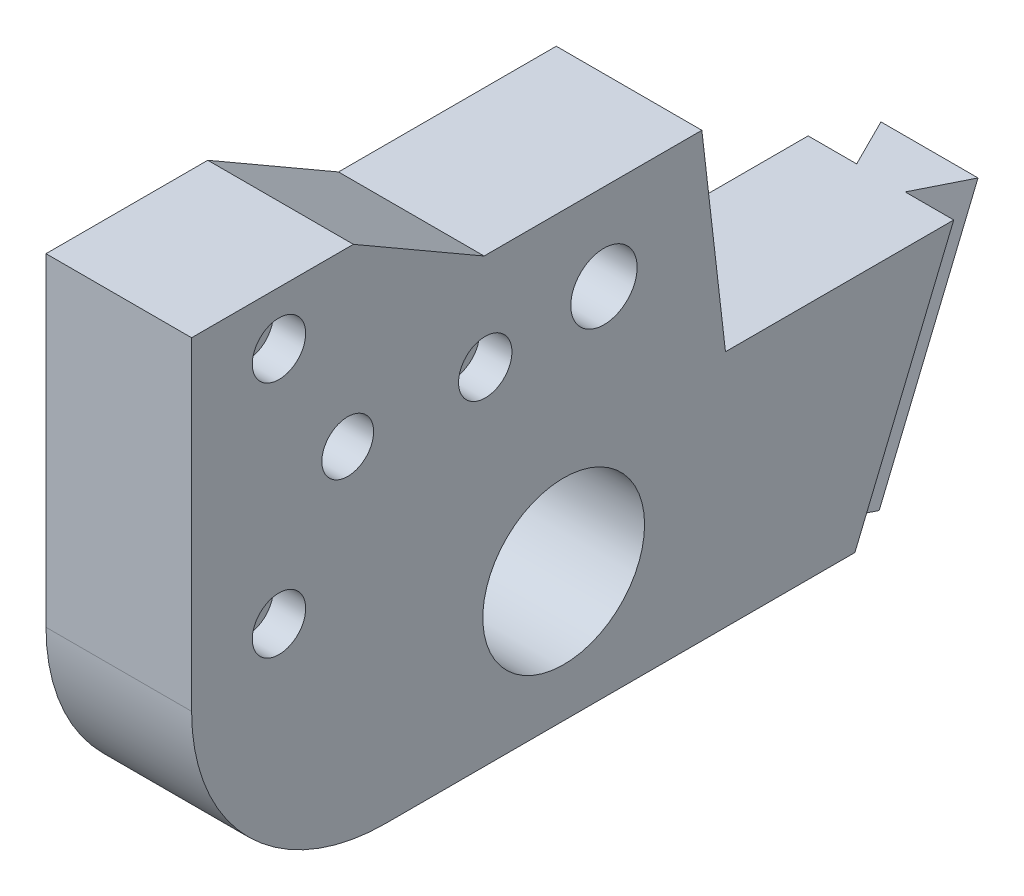
ISO-10303-21;
HEADER;
FILE_DESCRIPTION(('STEP AP214'),'2;1');
FILE_NAME('part.step','',(''),(''),'','','');
FILE_SCHEMA(('AUTOMOTIVE_DESIGN { 1 0 10303 214 1 1 1 1 }'));
ENDSEC;
DATA;
#1=APPLICATION_CONTEXT('core data for automotive mechanical design processes');
#2=APPLICATION_PROTOCOL_DEFINITION('international standard','automotive_design',2000,#1);
#3=PRODUCT_CONTEXT('',#1,'mechanical');
#4=PRODUCT('Part','Part','',(#3));
#5=PRODUCT_RELATED_PRODUCT_CATEGORY('part','',(#4));
#6=PRODUCT_DEFINITION_FORMATION('','',#4);
#7=PRODUCT_DEFINITION_CONTEXT('part definition',#1,'design');
#8=PRODUCT_DEFINITION('design','',#6,#7);
#9=PRODUCT_DEFINITION_SHAPE('','',#8);
#10=(LENGTH_UNIT() NAMED_UNIT(*) SI_UNIT(.MILLI.,.METRE.));
#11=(NAMED_UNIT(*) PLANE_ANGLE_UNIT() SI_UNIT($,.RADIAN.));
#12=(NAMED_UNIT(*) SI_UNIT($,.STERADIAN.) SOLID_ANGLE_UNIT());
#13=UNCERTAINTY_MEASURE_WITH_UNIT(LENGTH_MEASURE(1.E-05),#10,'distance_accuracy_value','');
#14=(GEOMETRIC_REPRESENTATION_CONTEXT(3) GLOBAL_UNCERTAINTY_ASSIGNED_CONTEXT((#13)) GLOBAL_UNIT_ASSIGNED_CONTEXT((#10,
#11,#12)) REPRESENTATION_CONTEXT('',''));
#15=CARTESIAN_POINT('',(0.,0.,0.));
#16=DIRECTION('',(0.,0.,1.));
#17=DIRECTION('',(1.,0.,0.));
#18=AXIS2_PLACEMENT_3D('',#15,#16,#17);
#19=CARTESIAN_POINT('',(-10.,14.9497604919768,41.3497604919769));
#20=DIRECTION('',(1.,0.,0.));
#21=DIRECTION('',(0.,0.,-1.));
#22=AXIS2_PLACEMENT_3D('',#19,#20,#21);
#23=PLANE('',#22);
#24=CARTESIAN_POINT('',(-10.,13.3497604919768,41.3497604919769));
#25=DIRECTION('',(-1.,0.,0.));
#26=DIRECTION('',(0.,0.,1.));
#27=AXIS2_PLACEMENT_3D('',#24,#25,#26);
#28=CIRCLE('',#27,1.60000000000001);
#29=CARTESIAN_POINT('',(-10.,13.3497604919768,42.9497604919769));
#30=VERTEX_POINT('',#29);
#31=EDGE_CURVE('E220',#30,#30,#28,.T.);
#32=ORIENTED_EDGE('',*,*,#31,.F.);
#33=EDGE_LOOP('',(#32));
#34=FACE_BOUND('',#33,.T.);
#35=CARTESIAN_POINT('',(-10.,13.3497604919768,41.3497604919769));
#36=DIRECTION('',(-1.,0.,0.));
#37=DIRECTION('',(0.,0.,1.));
#38=AXIS2_PLACEMENT_3D('',#35,#36,#37);
#39=CIRCLE('',#38,5.09999999999999);
#40=CARTESIAN_POINT('',(-10.,13.3497604919768,46.4497604919769));
#41=VERTEX_POINT('',#40);
#42=EDGE_CURVE('E225',#41,#41,#39,.T.);
#43=ORIENTED_EDGE('',*,*,#42,.T.);
#44=EDGE_LOOP('',(#43));
#45=FACE_BOUND('',#44,.T.);
#46=ADVANCED_FACE('F37',(#34,#45),#23,.F.);
#47=CARTESIAN_POINT('',(7.,13.3497604919768,41.3497604919769));
#48=DIRECTION('',(1.,0.,0.));
#49=DIRECTION('',(0.,0.,-1.));
#50=AXIS2_PLACEMENT_3D('',#47,#48,#49);
#51=CYLINDRICAL_SURFACE('',#50,1.60000000000001);
#52=ORIENTED_EDGE('',*,*,#31,.T.);
#53=EDGE_LOOP('',(#52));
#54=FACE_BOUND('',#53,.T.);
#55=CARTESIAN_POINT('',(-2.,13.3497604919768,41.3497604919769));
#56=DIRECTION('',(1.,0.,0.));
#57=DIRECTION('',(0.,0.,-1.));
#58=AXIS2_PLACEMENT_3D('',#55,#56,#57);
#59=CIRCLE('',#58,1.60000000000001);
#60=CARTESIAN_POINT('',(-2.,13.3497604919768,39.7497604919769));
#61=VERTEX_POINT('',#60);
#62=EDGE_CURVE('E239',#61,#61,#59,.F.);
#63=ORIENTED_EDGE('',*,*,#62,.F.);
#64=EDGE_LOOP('',(#63));
#65=FACE_BOUND('',#64,.T.);
#66=ADVANCED_FACE('F324',(#54,#65),#51,.F.);
#67=CARTESIAN_POINT('',(-11.,13.3497604919768,41.3497604919769));
#68=DIRECTION('',(-1.,0.,0.));
#69=DIRECTION('',(0.,0.,1.));
#70=AXIS2_PLACEMENT_3D('',#67,#68,#69);
#71=CYLINDRICAL_SURFACE('',#70,5.09999999999999);
#72=ORIENTED_EDGE('',*,*,#42,.F.);
#73=EDGE_LOOP('',(#72));
#74=FACE_BOUND('',#73,.T.);
#75=CARTESIAN_POINT('',(-11.,13.3497604919768,41.3497604919769));
#76=DIRECTION('',(-1.,0.,0.));
#77=DIRECTION('',(0.,0.,1.));
#78=AXIS2_PLACEMENT_3D('',#75,#76,#77);
#79=CIRCLE('',#78,5.09999999999999);
#80=CARTESIAN_POINT('',(-11.,13.3497604919768,46.4497604919769));
#81=VERTEX_POINT('',#80);
#82=EDGE_CURVE('E228',#81,#81,#79,.T.);
#83=ORIENTED_EDGE('',*,*,#82,.T.);
#84=EDGE_LOOP('',(#83));
#85=FACE_BOUND('',#84,.T.);
#86=ADVANCED_FACE('F330',(#74,#85),#71,.F.);
#87=CARTESIAN_POINT('',(-8.,-9.00146066220622,10.414818588469));
#88=DIRECTION('',(0.,-0.382683432365084,-0.923879532511289));
#89=DIRECTION('',(0.,0.923879532511289,-0.382683432365084));
#90=AXIS2_PLACEMENT_3D('',#87,#88,#89);
#91=PLANE('',#90);
#92=DIRECTION('',(0.,0.923879532511289,-0.382683432365084));
#93=VECTOR('',#92,1.);
#94=CARTESIAN_POINT('',(-8.,-9.00146066220622,10.414818588469));
#95=LINE('',#94,#93);
#96=CARTESIAN_POINT('',(-8.,-7.99999999999999,10.));
#97=VERTEX_POINT('',#96);
#98=CARTESIAN_POINT('',(-8.,6.75,3.89034995499696));
#99=VERTEX_POINT('',#98);
#100=EDGE_CURVE('E209',#97,#99,#95,.T.);
#101=ORIENTED_EDGE('',*,*,#100,.F.);
#102=DIRECTION('',(-1.,0.,0.));
#103=VECTOR('',#102,1.);
#104=CARTESIAN_POINT('',(-8.,-7.99999999999999,10.));
#105=LINE('',#104,#103);
#106=CARTESIAN_POINT('',(-11.,-7.99999999999999,10.));
#107=VERTEX_POINT('',#106);
#108=EDGE_CURVE('E212',#97,#107,#105,.T.);
#109=ORIENTED_EDGE('',*,*,#108,.T.);
#110=DIRECTION('',(0.,0.923879532511289,-0.382683432365084));
#111=VECTOR('',#110,1.);
#112=CARTESIAN_POINT('',(-11.,-9.00146066220622,10.414818588469));
#113=LINE('',#112,#111);
#114=CARTESIAN_POINT('',(-11.,6.75,3.89034995499696));
#115=VERTEX_POINT('',#114);
#116=EDGE_CURVE('E204',#107,#115,#113,.T.);
#117=ORIENTED_EDGE('',*,*,#116,.T.);
#118=DIRECTION('',(-1.,0.,0.));
#119=VECTOR('',#118,1.);
#120=CARTESIAN_POINT('',(-8.,6.75,3.89034995499696));
#121=LINE('',#120,#119);
#122=EDGE_CURVE('E200',#99,#115,#121,.T.);
#123=ORIENTED_EDGE('',*,*,#122,.F.);
#124=EDGE_LOOP('',(#101,#109,#117,#123));
#125=FACE_BOUND('',#124,.T.);
#126=ADVANCED_FACE('F342',(#125),#91,.T.);
#127=CARTESIAN_POINT('',(-8.,-9.00146066220622,10.414818588469));
#128=DIRECTION('',(-0.87946522406461,0.182143211721524,0.439732612032305));
#129=DIRECTION('',(0.447213595499958,0.,0.894427190999916));
#130=AXIS2_PLACEMENT_3D('',#127,#128,#129);
#131=PLANE('',#130);
#132=DIRECTION('',(0.,0.923879532511289,-0.382683432365084));
#133=VECTOR('',#132,1.);
#134=CARTESIAN_POINT('',(-9.5,-9.00146066220622,7.41481858846896));
#135=LINE('',#134,#133);
#136=CARTESIAN_POINT('',(-9.5,-7.99999999999999,7.));
#137=VERTEX_POINT('',#136);
#138=CARTESIAN_POINT('',(-9.5,6.75,0.890349954996931));
#139=VERTEX_POINT('',#138);
#140=EDGE_CURVE('E206',#137,#139,#135,.T.);
#141=ORIENTED_EDGE('',*,*,#140,.F.);
#142=DIRECTION('',(0.447213595499958,0.,0.894427190999916));
#143=VECTOR('',#142,1.);
#144=CARTESIAN_POINT('',(-7.83407256461242,-7.99999999999999,10.3318548707752));
#145=LINE('',#144,#143);
#146=EDGE_CURVE('E203',#137,#97,#145,.T.);
#147=ORIENTED_EDGE('',*,*,#146,.T.);
#148=ORIENTED_EDGE('',*,*,#100,.T.);
#149=DIRECTION('',(0.447213595499958,0.,0.894427190999916));
#150=VECTOR('',#149,1.);
#151=CARTESIAN_POINT('',(-5.3902125466112,6.75,9.10992486177456));
#152=LINE('',#151,#150);
#153=EDGE_CURVE('E192',#139,#99,#152,.T.);
#154=ORIENTED_EDGE('',*,*,#153,.F.);
#155=EDGE_LOOP('',(#141,#147,#148,#154));
#156=FACE_BOUND('',#155,.T.);
#157=ADVANCED_FACE('F340',(#156),#131,.T.);
#158=CARTESIAN_POINT('',(-11.,-7.99999999999999,6.99999999999997));
#159=DIRECTION('',(0.,-0.382683432365084,-0.923879532511289));
#160=DIRECTION('',(0.,0.923879532511289,-0.382683432365084));
#161=AXIS2_PLACEMENT_3D('',#158,#159,#160);
#162=PLANE('',#161);
#163=DIRECTION('',(1.,0.,0.));
#164=VECTOR('',#163,1.);
#165=CARTESIAN_POINT('',(-11.,-7.99999999999999,6.99999999999997));
#166=LINE('',#165,#164);
#167=CARTESIAN_POINT('',(-3.5,-7.99999999999999,6.99999999999997));
#168=VERTEX_POINT('',#167);
#169=EDGE_CURVE('E207',#137,#168,#166,.T.);
#170=ORIENTED_EDGE('',*,*,#169,.F.);
#171=ORIENTED_EDGE('',*,*,#140,.T.);
#172=DIRECTION('',(1.,0.,0.));
#173=VECTOR('',#172,1.);
#174=CARTESIAN_POINT('',(-11.,6.75,0.890349954996931));
#175=LINE('',#174,#173);
#176=CARTESIAN_POINT('',(-3.5,6.75,0.890349954996931));
#177=VERTEX_POINT('',#176);
#178=EDGE_CURVE('E218',#139,#177,#175,.T.);
#179=ORIENTED_EDGE('',*,*,#178,.T.);
#180=DIRECTION('',(0.,0.923879532511289,-0.382683432365085));
#181=VECTOR('',#180,1.);
#182=CARTESIAN_POINT('',(-3.5,-9.00146066220622,7.41481858846894));
#183=LINE('',#182,#181);
#184=EDGE_CURVE('E191',#168,#177,#183,.T.);
#185=ORIENTED_EDGE('',*,*,#184,.F.);
#186=EDGE_LOOP('',(#170,#171,#179,#185));
#187=FACE_BOUND('',#186,.T.);
#188=ADVANCED_FACE('F336',(#187),#162,.T.);
#189=CARTESIAN_POINT('',(-5.,-9.00146066220622,10.4148185884689));
#190=DIRECTION('',(0.87946522406461,0.182143211721524,0.439732612032305));
#191=DIRECTION('',(0.447213595499958,0.,-0.894427190999916));
#192=AXIS2_PLACEMENT_3D('',#189,#190,#191);
#193=PLANE('',#192);
#194=DIRECTION('',(0.,0.923879532511289,-0.382683432365085));
#195=VECTOR('',#194,1.);
#196=CARTESIAN_POINT('',(-5.,-9.00146066220622,10.4148185884689));
#197=LINE('',#196,#195);
#198=CARTESIAN_POINT('',(-5.,-7.99999999999999,9.99999999999999));
#199=VERTEX_POINT('',#198);
#200=CARTESIAN_POINT('',(-5.,6.75,3.89034995499693));
#201=VERTEX_POINT('',#200);
#202=EDGE_CURVE('E188',#199,#201,#197,.T.);
#203=ORIENTED_EDGE('',*,*,#202,.F.);
#204=DIRECTION('',(0.447213595499958,0.,-0.894427190999916));
#205=VECTOR('',#204,1.);
#206=CARTESIAN_POINT('',(-5.16592743538758,-7.99999999999999,10.3318548707752));
#207=LINE('',#206,#205);
#208=EDGE_CURVE('E195',#199,#168,#207,.T.);
#209=ORIENTED_EDGE('',*,*,#208,.T.);
#210=ORIENTED_EDGE('',*,*,#184,.T.);
#211=DIRECTION('',(0.447213595499958,0.,-0.894427190999916));
#212=VECTOR('',#211,1.);
#213=CARTESIAN_POINT('',(-7.6097874533888,6.75,9.10992486177455));
#214=LINE('',#213,#212);
#215=EDGE_CURVE('E187',#201,#177,#214,.T.);
#216=ORIENTED_EDGE('',*,*,#215,.F.);
#217=EDGE_LOOP('',(#203,#209,#210,#216));
#218=FACE_BOUND('',#217,.T.);
#219=ADVANCED_FACE('F339',(#218),#193,.T.);
#220=CARTESIAN_POINT('',(-2.,0.,28.));
#221=DIRECTION('',(-1.,0.,0.));
#222=DIRECTION('',(0.,0.,1.));
#223=AXIS2_PLACEMENT_3D('',#220,#221,#222);
#224=CYLINDRICAL_SURFACE('',#223,4.99999999999999);
#225=CARTESIAN_POINT('',(-11.,0.,28.));
#226=DIRECTION('',(1.,0.,0.));
#227=DIRECTION('',(0.,0.,-1.));
#228=AXIS2_PLACEMENT_3D('',#225,#226,#227);
#229=CIRCLE('',#228,5.);
#230=CARTESIAN_POINT('',(-11.,0.,23.));
#231=VERTEX_POINT('',#230);
#232=EDGE_CURVE('E184',#231,#231,#229,.T.);
#233=ORIENTED_EDGE('',*,*,#232,.F.);
#234=EDGE_LOOP('',(#233));
#235=FACE_BOUND('',#234,.T.);
#236=CARTESIAN_POINT('',(-2.,0.,28.));
#237=DIRECTION('',(1.,0.,0.));
#238=DIRECTION('',(0.,0.,-1.));
#239=AXIS2_PLACEMENT_3D('',#236,#237,#238);
#240=CIRCLE('',#239,4.99999999999999);
#241=CARTESIAN_POINT('',(-2.,0.,23.));
#242=VERTEX_POINT('',#241);
#243=EDGE_CURVE('E236',#242,#242,#240,.F.);
#244=ORIENTED_EDGE('',*,*,#243,.F.);
#245=EDGE_LOOP('',(#244));
#246=FACE_BOUND('',#245,.T.);
#247=ADVANCED_FACE('F351',(#235,#246),#224,.F.);
#248=CARTESIAN_POINT('',(-11.,0.,0.));
#249=DIRECTION('',(1.,0.,0.));
#250=DIRECTION('',(0.,0.,1.));
#251=AXIS2_PLACEMENT_3D('',#248,#249,#250);
#252=PLANE('',#251);
#253=CARTESIAN_POINT('',(-11.,13.3497604919768,32.8497604919769));
#254=DIRECTION('',(1.,0.,0.));
#255=DIRECTION('',(0.,0.,-1.));
#256=AXIS2_PLACEMENT_3D('',#253,#254,#255);
#257=CIRCLE('',#256,1.05);
#258=CARTESIAN_POINT('',(-11.,13.3497604919768,31.7997604919769));
#259=VERTEX_POINT('',#258);
#260=EDGE_CURVE('E285',#259,#259,#257,.T.);
#261=ORIENTED_EDGE('',*,*,#260,.T.);
#262=EDGE_LOOP('',(#261));
#263=FACE_BOUND('',#262,.T.);
#264=CARTESIAN_POINT('',(-11.,20.7109764241445,45.599760491977));
#265=DIRECTION('',(1.,0.,0.));
#266=DIRECTION('',(0.,0.,-1.));
#267=AXIS2_PLACEMENT_3D('',#264,#265,#266);
#268=CIRCLE('',#267,1.05);
#269=CARTESIAN_POINT('',(-11.,20.7109764241445,44.549760491977));
#270=VERTEX_POINT('',#269);
#271=EDGE_CURVE('E273',#270,#270,#268,.T.);
#272=ORIENTED_EDGE('',*,*,#271,.T.);
#273=EDGE_LOOP('',(#272));
#274=FACE_BOUND('',#273,.T.);
#275=CARTESIAN_POINT('',(-11.,5.98854455980901,45.5997604919769));
#276=DIRECTION('',(1.,0.,0.));
#277=DIRECTION('',(0.,0.,-1.));
#278=AXIS2_PLACEMENT_3D('',#275,#276,#277);
#279=CIRCLE('',#278,1.05);
#280=CARTESIAN_POINT('',(-11.,5.98854455980901,44.5497604919769));
#281=VERTEX_POINT('',#280);
#282=EDGE_CURVE('E261',#281,#281,#279,.T.);
#283=ORIENTED_EDGE('',*,*,#282,.T.);
#284=EDGE_LOOP('',(#283));
#285=FACE_BOUND('',#284,.T.);
#286=CARTESIAN_POINT('',(-11.,14.,25.5107624657242));
#287=DIRECTION('',(1.,0.,0.));
#288=DIRECTION('',(0.,0.,-1.));
#289=AXIS2_PLACEMENT_3D('',#286,#287,#288);
#290=CIRCLE('',#289,2.05);
#291=CARTESIAN_POINT('',(-11.,14.,23.4607624657242));
#292=VERTEX_POINT('',#291);
#293=EDGE_CURVE('E255',#292,#292,#290,.T.);
#294=ORIENTED_EDGE('',*,*,#293,.T.);
#295=EDGE_LOOP('',(#294));
#296=FACE_BOUND('',#295,.T.);
#297=ORIENTED_EDGE('',*,*,#82,.F.);
#298=EDGE_LOOP('',(#297));
#299=FACE_BOUND('',#298,.T.);
#300=ORIENTED_EDGE('',*,*,#232,.T.);
#301=EDGE_LOOP('',(#300));
#302=FACE_BOUND('',#301,.T.);
#303=DIRECTION('',(0.,-0.5,-0.866025403784439));
#304=VECTOR('',#303,1.);
#305=CARTESIAN_POINT('',(-11.,0.246479222419003,-0.142304845413261));
#306=LINE('',#305,#304);
#307=CARTESIAN_POINT('',(-11.,24.,41.));
#308=VERTEX_POINT('',#307);
#309=CARTESIAN_POINT('',(-11.,19.3347932190907,32.9196248276503));
#310=VERTEX_POINT('',#309);
#311=EDGE_CURVE('E234',#308,#310,#306,.T.);
#312=ORIENTED_EDGE('',*,*,#311,.T.);
#313=DIRECTION('',(0.,0.,-1.));
#314=VECTOR('',#313,1.);
#315=CARTESIAN_POINT('',(-11.,19.3347932190907,0.));
#316=LINE('',#315,#314);
#317=CARTESIAN_POINT('',(-11.,19.3347932190907,19.4591064601844));
#318=VERTEX_POINT('',#317);
#319=EDGE_CURVE('E231',#310,#318,#316,.T.);
#320=ORIENTED_EDGE('',*,*,#319,.T.);
#321=DIRECTION('',(0.,-0.993345736033198,-0.115170520119791));
#322=VECTOR('',#321,1.);
#323=CARTESIAN_POINT('',(-11.,6.75,18.));
#324=LINE('',#323,#322);
#325=CARTESIAN_POINT('',(-11.,6.75,18.));
#326=VERTEX_POINT('',#325);
#327=EDGE_CURVE('E179',#318,#326,#324,.T.);
#328=ORIENTED_EDGE('',*,*,#327,.T.);
#329=DIRECTION('',(0.,0.,-1.));
#330=VECTOR('',#329,1.);
#331=CARTESIAN_POINT('',(-11.,6.75,-4.00000000000001));
#332=LINE('',#331,#330);
#333=EDGE_CURVE('E181',#326,#115,#332,.T.);
#334=ORIENTED_EDGE('',*,*,#333,.T.);
#335=ORIENTED_EDGE('',*,*,#116,.F.);
#336=DIRECTION('',(0.,0.,1.));
#337=VECTOR('',#336,1.);
#338=CARTESIAN_POINT('',(-11.,-7.99999999999999,-1.));
#339=LINE('',#338,#337);
#340=CARTESIAN_POINT('',(-11.,-7.99999999999999,39.));
#341=VERTEX_POINT('',#340);
#342=EDGE_CURVE('E174',#107,#341,#339,.T.);
#343=ORIENTED_EDGE('',*,*,#342,.T.);
#344=CARTESIAN_POINT('',(-11.,4.00000000000001,39.));
#345=DIRECTION('',(1.,0.,0.));
#346=DIRECTION('',(0.,0.,-1.));
#347=AXIS2_PLACEMENT_3D('',#344,#345,#346);
#348=CIRCLE('',#347,12.);
#349=CARTESIAN_POINT('',(-11.,4.00000000000001,51.));
#350=VERTEX_POINT('',#349);
#351=EDGE_CURVE('E11',#341,#350,#348,.F.);
#352=ORIENTED_EDGE('',*,*,#351,.T.);
#353=DIRECTION('',(0.,1.,0.));
#354=VECTOR('',#353,1.);
#355=CARTESIAN_POINT('',(-11.,-7.99999999999999,51.));
#356=LINE('',#355,#354);
#357=CARTESIAN_POINT('',(-11.,24.,51.));
#358=VERTEX_POINT('',#357);
#359=EDGE_CURVE('E176',#350,#358,#356,.T.);
#360=ORIENTED_EDGE('',*,*,#359,.T.);
#361=DIRECTION('',(0.,0.,-1.));
#362=VECTOR('',#361,1.);
#363=CARTESIAN_POINT('',(-11.,24.,51.));
#364=LINE('',#363,#362);
#365=EDGE_CURVE('E172',#358,#308,#364,.T.);
#366=ORIENTED_EDGE('',*,*,#365,.T.);
#367=EDGE_LOOP('',(#312,#320,#328,#334,#335,#343,#352,#360,#366));
#368=FACE_BOUND('',#367,.T.);
#369=ADVANCED_FACE('F353',(#263,#274,#285,#296,#299,#302,#368),#252,.F.);
#370=CARTESIAN_POINT('',(-86.5412431259941,19.3347932190907,19.4591064601844));
#371=DIRECTION('',(0.,1.,0.));
#372=DIRECTION('',(0.,0.,1.));
#373=AXIS2_PLACEMENT_3D('',#370,#371,#372);
#374=PLANE('',#373);
#375=DIRECTION('',(1.,0.,0.));
#376=VECTOR('',#375,1.);
#377=CARTESIAN_POINT('',(-86.5412431259941,19.3347932190907,32.9196248276503));
#378=LINE('',#377,#376);
#379=CARTESIAN_POINT('',(-2.,19.3347932190907,32.9196248276503));
#380=VERTEX_POINT('',#379);
#381=EDGE_CURVE('E52',#310,#380,#378,.T.);
#382=ORIENTED_EDGE('',*,*,#381,.T.);
#383=DIRECTION('',(0.,0.,-1.));
#384=VECTOR('',#383,1.);
#385=CARTESIAN_POINT('',(-2.,19.3347932190907,19.4591064601844));
#386=LINE('',#385,#384);
#387=CARTESIAN_POINT('',(-2.,19.3347932190907,19.4591064601844));
#388=VERTEX_POINT('',#387);
#389=EDGE_CURVE('E242',#380,#388,#386,.T.);
#390=ORIENTED_EDGE('',*,*,#389,.T.);
#391=DIRECTION('',(-1.,0.,0.));
#392=VECTOR('',#391,1.);
#393=CARTESIAN_POINT('',(-2.,19.3347932190907,19.4591064601844));
#394=LINE('',#393,#392);
#395=EDGE_CURVE('E146',#388,#318,#394,.T.);
#396=ORIENTED_EDGE('',*,*,#395,.T.);
#397=ORIENTED_EDGE('',*,*,#319,.F.);
#398=EDGE_LOOP('',(#382,#390,#396,#397));
#399=FACE_BOUND('',#398,.T.);
#400=ADVANCED_FACE('F355',(#399),#374,.T.);
#401=CARTESIAN_POINT('',(-86.5412431259941,19.3347932190907,32.9196248276503));
#402=DIRECTION('',(0.,0.866025403784438,-0.5));
#403=DIRECTION('',(0.,0.5,0.866025403784438));
#404=AXIS2_PLACEMENT_3D('',#401,#402,#403);
#405=PLANE('',#404);
#406=DIRECTION('',(1.,0.,0.));
#407=VECTOR('',#406,1.);
#408=CARTESIAN_POINT('',(-86.5412431259941,24.,41.));
#409=LINE('',#408,#407);
#410=CARTESIAN_POINT('',(-2.,24.,41.));
#411=VERTEX_POINT('',#410);
#412=EDGE_CURVE('E60',#308,#411,#409,.T.);
#413=ORIENTED_EDGE('',*,*,#412,.T.);
#414=DIRECTION('',(0.,-0.5,-0.866025403784438));
#415=VECTOR('',#414,1.);
#416=CARTESIAN_POINT('',(-2.,19.3347932190907,32.9196248276503));
#417=LINE('',#416,#415);
#418=EDGE_CURVE('E251',#411,#380,#417,.T.);
#419=ORIENTED_EDGE('',*,*,#418,.T.);
#420=ORIENTED_EDGE('',*,*,#381,.F.);
#421=ORIENTED_EDGE('',*,*,#311,.F.);
#422=EDGE_LOOP('',(#413,#419,#420,#421));
#423=FACE_BOUND('',#422,.T.);
#424=ADVANCED_FACE('F358',(#423),#405,.T.);
#425=CARTESIAN_POINT('',(7.,4.00000000000001,39.));
#426=DIRECTION('',(1.,0.,0.));
#427=DIRECTION('',(0.,0.,-1.));
#428=AXIS2_PLACEMENT_3D('',#425,#426,#427);
#429=CYLINDRICAL_SURFACE('',#428,12.);
#430=ORIENTED_EDGE('',*,*,#351,.F.);
#431=DIRECTION('',(1.,0.,0.));
#432=VECTOR('',#431,1.);
#433=CARTESIAN_POINT('',(7.,-7.99999999999999,39.));
#434=LINE('',#433,#432);
#435=CARTESIAN_POINT('',(-2.,-7.99999999999999,39.));
#436=VERTEX_POINT('',#435);
#437=EDGE_CURVE('E45',#436,#341,#434,.F.);
#438=ORIENTED_EDGE('',*,*,#437,.F.);
#439=CARTESIAN_POINT('',(-2.,4.00000000000001,39.));
#440=DIRECTION('',(-1.,0.,0.));
#441=DIRECTION('',(0.,0.,1.));
#442=AXIS2_PLACEMENT_3D('',#439,#440,#441);
#443=CIRCLE('',#442,12.);
#444=CARTESIAN_POINT('',(-2.,4.00000000000001,51.));
#445=VERTEX_POINT('',#444);
#446=EDGE_CURVE('E134',#436,#445,#443,.T.);
#447=ORIENTED_EDGE('',*,*,#446,.T.);
#448=DIRECTION('',(1.,0.,0.));
#449=VECTOR('',#448,1.);
#450=CARTESIAN_POINT('',(7.,4.00000000000001,51.));
#451=LINE('',#450,#449);
#452=EDGE_CURVE('E159',#350,#445,#451,.T.);
#453=ORIENTED_EDGE('',*,*,#452,.F.);
#454=EDGE_LOOP('',(#430,#438,#447,#453));
#455=FACE_BOUND('',#454,.T.);
#456=ADVANCED_FACE('F39',(#455),#429,.T.);
#457=CARTESIAN_POINT('',(7.,-7.99999999999999,51.));
#458=DIRECTION('',(0.,0.,1.));
#459=DIRECTION('',(1.,0.,0.));
#460=AXIS2_PLACEMENT_3D('',#457,#458,#459);
#461=PLANE('',#460);
#462=ORIENTED_EDGE('',*,*,#452,.T.);
#463=DIRECTION('',(0.,1.,0.));
#464=VECTOR('',#463,1.);
#465=CARTESIAN_POINT('',(-2.,-7.99999999999999,51.));
#466=LINE('',#465,#464);
#467=CARTESIAN_POINT('',(-2.,24.,51.));
#468=VERTEX_POINT('',#467);
#469=EDGE_CURVE('E141',#445,#468,#466,.T.);
#470=ORIENTED_EDGE('',*,*,#469,.T.);
#471=DIRECTION('',(-1.,0.,0.));
#472=VECTOR('',#471,1.);
#473=CARTESIAN_POINT('',(7.,24.,51.));
#474=LINE('',#473,#472);
#475=EDGE_CURVE('E147',#468,#358,#474,.T.);
#476=ORIENTED_EDGE('',*,*,#475,.T.);
#477=ORIENTED_EDGE('',*,*,#359,.F.);
#478=EDGE_LOOP('',(#462,#470,#476,#477));
#479=FACE_BOUND('',#478,.T.);
#480=ADVANCED_FACE('F368',(#479),#461,.T.);
#481=CARTESIAN_POINT('',(1.,-9.00146066220622,10.4148185884689));
#482=DIRECTION('',(0.,-0.382683432365085,-0.923879532511289));
#483=DIRECTION('',(0.,0.923879532511289,-0.382683432365085));
#484=AXIS2_PLACEMENT_3D('',#481,#482,#483);
#485=PLANE('',#484);
#486=DIRECTION('',(-1.,0.,0.));
#487=VECTOR('',#486,1.);
#488=CARTESIAN_POINT('',(1.,6.75,3.89034995499693));
#489=LINE('',#488,#487);
#490=CARTESIAN_POINT('',(-2.,6.75,3.89034995499693));
#491=VERTEX_POINT('',#490);
#492=EDGE_CURVE('E167',#491,#201,#489,.T.);
#493=ORIENTED_EDGE('',*,*,#492,.F.);
#494=DIRECTION('',(0.,-0.923879532511289,0.382683432365085));
#495=VECTOR('',#494,1.);
#496=CARTESIAN_POINT('',(-2.,-9.00146066220622,10.4148185884689));
#497=LINE('',#496,#495);
#498=CARTESIAN_POINT('',(-2.,-7.99999999999999,9.99999999999999));
#499=VERTEX_POINT('',#498);
#500=EDGE_CURVE('E249',#491,#499,#497,.T.);
#501=ORIENTED_EDGE('',*,*,#500,.T.);
#502=DIRECTION('',(-1.,0.,0.));
#503=VECTOR('',#502,1.);
#504=CARTESIAN_POINT('',(1.,-7.99999999999999,9.99999999999999));
#505=LINE('',#504,#503);
#506=EDGE_CURVE('E156',#499,#199,#505,.T.);
#507=ORIENTED_EDGE('',*,*,#506,.T.);
#508=ORIENTED_EDGE('',*,*,#202,.T.);
#509=EDGE_LOOP('',(#493,#501,#507,#508));
#510=FACE_BOUND('',#509,.T.);
#511=ADVANCED_FACE('F364',(#510),#485,.T.);
#512=CARTESIAN_POINT('',(-2.,6.75,-4.00000000000001));
#513=DIRECTION('',(0.,-1.,0.));
#514=DIRECTION('',(0.,0.,-1.));
#515=AXIS2_PLACEMENT_3D('',#512,#513,#514);
#516=PLANE('',#515);
#517=DIRECTION('',(0.,0.,1.));
#518=VECTOR('',#517,1.);
#519=CARTESIAN_POINT('',(-2.,6.75,-4.00000000000001));
#520=LINE('',#519,#518);
#521=CARTESIAN_POINT('',(-2.,6.75,18.));
#522=VERTEX_POINT('',#521);
#523=EDGE_CURVE('E247',#491,#522,#520,.T.);
#524=ORIENTED_EDGE('',*,*,#523,.F.);
#525=ORIENTED_EDGE('',*,*,#492,.T.);
#526=ORIENTED_EDGE('',*,*,#215,.T.);
#527=ORIENTED_EDGE('',*,*,#178,.F.);
#528=ORIENTED_EDGE('',*,*,#153,.T.);
#529=ORIENTED_EDGE('',*,*,#122,.T.);
#530=ORIENTED_EDGE('',*,*,#333,.F.);
#531=DIRECTION('',(1.,0.,0.));
#532=VECTOR('',#531,1.);
#533=CARTESIAN_POINT('',(-2.,6.75,18.));
#534=LINE('',#533,#532);
#535=EDGE_CURVE('E164',#326,#522,#534,.T.);
#536=ORIENTED_EDGE('',*,*,#535,.T.);
#537=EDGE_LOOP('',(#524,#525,#526,#527,#528,#529,#530,#536));
#538=FACE_BOUND('',#537,.T.);
#539=ADVANCED_FACE('F367',(#538),#516,.F.);
#540=CARTESIAN_POINT('',(7.,-7.99999999999999,-1.));
#541=DIRECTION('',(0.,-1.,0.));
#542=DIRECTION('',(0.,0.,-1.));
#543=AXIS2_PLACEMENT_3D('',#540,#541,#542);
#544=PLANE('',#543);
#545=ORIENTED_EDGE('',*,*,#506,.F.);
#546=DIRECTION('',(0.,0.,1.));
#547=VECTOR('',#546,1.);
#548=CARTESIAN_POINT('',(-2.,-7.99999999999999,-1.));
#549=LINE('',#548,#547);
#550=EDGE_CURVE('E138',#499,#436,#549,.T.);
#551=ORIENTED_EDGE('',*,*,#550,.T.);
#552=ORIENTED_EDGE('',*,*,#437,.T.);
#553=ORIENTED_EDGE('',*,*,#342,.F.);
#554=ORIENTED_EDGE('',*,*,#108,.F.);
#555=ORIENTED_EDGE('',*,*,#146,.F.);
#556=ORIENTED_EDGE('',*,*,#169,.T.);
#557=ORIENTED_EDGE('',*,*,#208,.F.);
#558=EDGE_LOOP('',(#545,#551,#552,#553,#554,#555,#556,#557));
#559=FACE_BOUND('',#558,.T.);
#560=ADVANCED_FACE('F152',(#559),#544,.T.);
#561=CARTESIAN_POINT('',(-2.,6.75,18.));
#562=DIRECTION('',(0.,-0.115170520119791,0.993345736033198));
#563=DIRECTION('',(0.,-0.993345736033198,-0.115170520119791));
#564=AXIS2_PLACEMENT_3D('',#561,#562,#563);
#565=PLANE('',#564);
#566=DIRECTION('',(0.,0.993345736033198,0.115170520119791));
#567=VECTOR('',#566,1.);
#568=CARTESIAN_POINT('',(-2.,6.75,18.));
#569=LINE('',#568,#567);
#570=EDGE_CURVE('E245',#522,#388,#569,.T.);
#571=ORIENTED_EDGE('',*,*,#570,.F.);
#572=ORIENTED_EDGE('',*,*,#535,.F.);
#573=ORIENTED_EDGE('',*,*,#327,.F.);
#574=ORIENTED_EDGE('',*,*,#395,.F.);
#575=EDGE_LOOP('',(#571,#572,#573,#574));
#576=FACE_BOUND('',#575,.T.);
#577=ADVANCED_FACE('F376',(#576),#565,.F.);
#578=CARTESIAN_POINT('',(7.,24.,51.));
#579=DIRECTION('',(0.,1.,0.));
#580=DIRECTION('',(0.,0.,1.));
#581=AXIS2_PLACEMENT_3D('',#578,#579,#580);
#582=PLANE('',#581);
#583=ORIENTED_EDGE('',*,*,#475,.F.);
#584=DIRECTION('',(0.,0.,-1.));
#585=VECTOR('',#584,1.);
#586=CARTESIAN_POINT('',(-2.,24.,51.));
#587=LINE('',#586,#585);
#588=EDGE_CURVE('E157',#468,#411,#587,.T.);
#589=ORIENTED_EDGE('',*,*,#588,.T.);
#590=ORIENTED_EDGE('',*,*,#412,.F.);
#591=ORIENTED_EDGE('',*,*,#365,.F.);
#592=EDGE_LOOP('',(#583,#589,#590,#591));
#593=FACE_BOUND('',#592,.T.);
#594=ADVANCED_FACE('F303',(#593),#582,.T.);
#595=CARTESIAN_POINT('',(-2.,0.,0.));
#596=DIRECTION('',(1.,0.,0.));
#597=DIRECTION('',(0.,0.,1.));
#598=AXIS2_PLACEMENT_3D('',#595,#596,#597);
#599=PLANE('',#598);
#600=CARTESIAN_POINT('',(-2.,13.3497604919768,32.8497604919769));
#601=DIRECTION('',(1.,0.,0.));
#602=DIRECTION('',(0.,0.,-1.));
#603=AXIS2_PLACEMENT_3D('',#600,#601,#602);
#604=CIRCLE('',#603,1.65);
#605=CARTESIAN_POINT('',(-2.,13.3497604919768,31.1997604919769));
#606=VERTEX_POINT('',#605);
#607=EDGE_CURVE('E294',#606,#606,#604,.T.);
#608=ORIENTED_EDGE('',*,*,#607,.F.);
#609=EDGE_LOOP('',(#608));
#610=FACE_BOUND('',#609,.T.);
#611=CARTESIAN_POINT('',(-2.,20.7109764241445,45.599760491977));
#612=DIRECTION('',(1.,0.,0.));
#613=DIRECTION('',(0.,0.,-1.));
#614=AXIS2_PLACEMENT_3D('',#611,#612,#613);
#615=CIRCLE('',#614,1.65);
#616=CARTESIAN_POINT('',(-2.,20.7109764241445,43.949760491977));
#617=VERTEX_POINT('',#616);
#618=EDGE_CURVE('E282',#617,#617,#615,.T.);
#619=ORIENTED_EDGE('',*,*,#618,.F.);
#620=EDGE_LOOP('',(#619));
#621=FACE_BOUND('',#620,.T.);
#622=CARTESIAN_POINT('',(-2.,5.98854455980901,45.5997604919769));
#623=DIRECTION('',(1.,0.,0.));
#624=DIRECTION('',(0.,0.,-1.));
#625=AXIS2_PLACEMENT_3D('',#622,#623,#624);
#626=CIRCLE('',#625,1.65);
#627=CARTESIAN_POINT('',(-2.,5.98854455980901,43.9497604919769));
#628=VERTEX_POINT('',#627);
#629=EDGE_CURVE('E270',#628,#628,#626,.T.);
#630=ORIENTED_EDGE('',*,*,#629,.F.);
#631=EDGE_LOOP('',(#630));
#632=FACE_BOUND('',#631,.T.);
#633=CARTESIAN_POINT('',(-2.,14.,25.5107624657242));
#634=DIRECTION('',(1.,0.,0.));
#635=DIRECTION('',(0.,0.,-1.));
#636=AXIS2_PLACEMENT_3D('',#633,#634,#635);
#637=CIRCLE('',#636,2.04999999999999);
#638=CARTESIAN_POINT('',(-2.,14.,23.4607624657242));
#639=VERTEX_POINT('',#638);
#640=EDGE_CURVE('E258',#639,#639,#637,.T.);
#641=ORIENTED_EDGE('',*,*,#640,.F.);
#642=EDGE_LOOP('',(#641));
#643=FACE_BOUND('',#642,.T.);
#644=ORIENTED_EDGE('',*,*,#418,.F.);
#645=ORIENTED_EDGE('',*,*,#588,.F.);
#646=ORIENTED_EDGE('',*,*,#469,.F.);
#647=ORIENTED_EDGE('',*,*,#446,.F.);
#648=ORIENTED_EDGE('',*,*,#550,.F.);
#649=ORIENTED_EDGE('',*,*,#500,.F.);
#650=ORIENTED_EDGE('',*,*,#523,.T.);
#651=ORIENTED_EDGE('',*,*,#570,.T.);
#652=ORIENTED_EDGE('',*,*,#389,.F.);
#653=EDGE_LOOP('',(#644,#645,#646,#647,#648,#649,#650,#651,#652));
#654=FACE_BOUND('',#653,.T.);
#655=ORIENTED_EDGE('',*,*,#62,.T.);
#656=EDGE_LOOP('',(#655));
#657=FACE_BOUND('',#656,.T.);
#658=ORIENTED_EDGE('',*,*,#243,.T.);
#659=EDGE_LOOP('',(#658));
#660=FACE_BOUND('',#659,.T.);
#661=ADVANCED_FACE('F136',(#610,#621,#632,#643,#654,#657,#660),#599,.T.);
#662=CARTESIAN_POINT('',(-2.,14.,25.5107624657242));
#663=DIRECTION('',(1.,0.,0.));
#664=DIRECTION('',(0.,0.,-1.));
#665=AXIS2_PLACEMENT_3D('',#662,#663,#664);
#666=CYLINDRICAL_SURFACE('',#665,2.04999999999999);
#667=ORIENTED_EDGE('',*,*,#293,.F.);
#668=EDGE_LOOP('',(#667));
#669=FACE_BOUND('',#668,.T.);
#670=ORIENTED_EDGE('',*,*,#640,.T.);
#671=EDGE_LOOP('',(#670));
#672=FACE_BOUND('',#671,.T.);
#673=ADVANCED_FACE('F302',(#669,#672),#666,.F.);
#674=CARTESIAN_POINT('',(-2.,5.98854455980901,45.5997604919769));
#675=DIRECTION('',(1.,0.,0.));
#676=DIRECTION('',(0.,0.,-1.));
#677=AXIS2_PLACEMENT_3D('',#674,#675,#676);
#678=CYLINDRICAL_SURFACE('',#677,1.05);
#679=ORIENTED_EDGE('',*,*,#282,.F.);
#680=EDGE_LOOP('',(#679));
#681=FACE_BOUND('',#680,.T.);
#682=CARTESIAN_POINT('',(-4.,5.98854455980901,45.5997604919769));
#683=DIRECTION('',(1.,0.,0.));
#684=DIRECTION('',(0.,0.,-1.));
#685=AXIS2_PLACEMENT_3D('',#682,#683,#684);
#686=CIRCLE('',#685,1.05);
#687=CARTESIAN_POINT('',(-4.,5.98854455980901,44.5497604919769));
#688=VERTEX_POINT('',#687);
#689=EDGE_CURVE('E264',#688,#688,#686,.T.);
#690=ORIENTED_EDGE('',*,*,#689,.T.);
#691=EDGE_LOOP('',(#690));
#692=FACE_BOUND('',#691,.T.);
#693=ADVANCED_FACE('F312',(#681,#692),#678,.F.);
#694=CARTESIAN_POINT('',(-4.,7.03854455980901,45.5997604919769));
#695=DIRECTION('',(-1.,0.,0.));
#696=DIRECTION('',(0.,0.,1.));
#697=AXIS2_PLACEMENT_3D('',#694,#695,#696);
#698=PLANE('',#697);
#699=ORIENTED_EDGE('',*,*,#689,.F.);
#700=EDGE_LOOP('',(#699));
#701=FACE_BOUND('',#700,.T.);
#702=CARTESIAN_POINT('',(-4.,5.98854455980901,45.5997604919769));
#703=DIRECTION('',(1.,0.,0.));
#704=DIRECTION('',(0.,0.,-1.));
#705=AXIS2_PLACEMENT_3D('',#702,#703,#704);
#706=CIRCLE('',#705,1.65);
#707=CARTESIAN_POINT('',(-4.,5.98854455980901,43.9497604919769));
#708=VERTEX_POINT('',#707);
#709=EDGE_CURVE('E267',#708,#708,#706,.T.);
#710=ORIENTED_EDGE('',*,*,#709,.T.);
#711=EDGE_LOOP('',(#710));
#712=FACE_BOUND('',#711,.T.);
#713=ADVANCED_FACE('F318',(#701,#712),#698,.F.);
#714=CARTESIAN_POINT('',(-2.,5.98854455980901,45.5997604919769));
#715=DIRECTION('',(1.,0.,0.));
#716=DIRECTION('',(0.,0.,-1.));
#717=AXIS2_PLACEMENT_3D('',#714,#715,#716);
#718=CYLINDRICAL_SURFACE('',#717,1.65);
#719=ORIENTED_EDGE('',*,*,#709,.F.);
#720=EDGE_LOOP('',(#719));
#721=FACE_BOUND('',#720,.T.);
#722=ORIENTED_EDGE('',*,*,#629,.T.);
#723=EDGE_LOOP('',(#722));
#724=FACE_BOUND('',#723,.T.);
#725=ADVANCED_FACE('F533',(#721,#724),#718,.F.);
#726=CARTESIAN_POINT('',(-2.,20.7109764241445,45.599760491977));
#727=DIRECTION('',(1.,0.,0.));
#728=DIRECTION('',(0.,0.,-1.));
#729=AXIS2_PLACEMENT_3D('',#726,#727,#728);
#730=CYLINDRICAL_SURFACE('',#729,1.05);
#731=ORIENTED_EDGE('',*,*,#271,.F.);
#732=EDGE_LOOP('',(#731));
#733=FACE_BOUND('',#732,.T.);
#734=CARTESIAN_POINT('',(-4.,20.7109764241445,45.599760491977));
#735=DIRECTION('',(1.,0.,0.));
#736=DIRECTION('',(0.,0.,-1.));
#737=AXIS2_PLACEMENT_3D('',#734,#735,#736);
#738=CIRCLE('',#737,1.05);
#739=CARTESIAN_POINT('',(-4.,20.7109764241445,44.549760491977));
#740=VERTEX_POINT('',#739);
#741=EDGE_CURVE('E276',#740,#740,#738,.T.);
#742=ORIENTED_EDGE('',*,*,#741,.T.);
#743=EDGE_LOOP('',(#742));
#744=FACE_BOUND('',#743,.T.);
#745=ADVANCED_FACE('F542',(#733,#744),#730,.F.);
#746=CARTESIAN_POINT('',(-4.,21.7609764241445,45.599760491977));
#747=DIRECTION('',(-1.,0.,0.));
#748=DIRECTION('',(0.,0.,1.));
#749=AXIS2_PLACEMENT_3D('',#746,#747,#748);
#750=PLANE('',#749);
#751=ORIENTED_EDGE('',*,*,#741,.F.);
#752=EDGE_LOOP('',(#751));
#753=FACE_BOUND('',#752,.T.);
#754=CARTESIAN_POINT('',(-4.,20.7109764241445,45.599760491977));
#755=DIRECTION('',(1.,0.,0.));
#756=DIRECTION('',(0.,0.,-1.));
#757=AXIS2_PLACEMENT_3D('',#754,#755,#756);
#758=CIRCLE('',#757,1.65);
#759=CARTESIAN_POINT('',(-4.,20.7109764241445,43.949760491977));
#760=VERTEX_POINT('',#759);
#761=EDGE_CURVE('E279',#760,#760,#758,.T.);
#762=ORIENTED_EDGE('',*,*,#761,.T.);
#763=EDGE_LOOP('',(#762));
#764=FACE_BOUND('',#763,.T.);
#765=ADVANCED_FACE('F552',(#753,#764),#750,.F.);
#766=CARTESIAN_POINT('',(-2.,20.7109764241445,45.599760491977));
#767=DIRECTION('',(1.,0.,0.));
#768=DIRECTION('',(0.,0.,-1.));
#769=AXIS2_PLACEMENT_3D('',#766,#767,#768);
#770=CYLINDRICAL_SURFACE('',#769,1.65);
#771=ORIENTED_EDGE('',*,*,#761,.F.);
#772=EDGE_LOOP('',(#771));
#773=FACE_BOUND('',#772,.T.);
#774=ORIENTED_EDGE('',*,*,#618,.T.);
#775=EDGE_LOOP('',(#774));
#776=FACE_BOUND('',#775,.T.);
#777=ADVANCED_FACE('F561',(#773,#776),#770,.F.);
#778=CARTESIAN_POINT('',(-2.,13.3497604919768,32.8497604919769));
#779=DIRECTION('',(1.,0.,0.));
#780=DIRECTION('',(0.,0.,-1.));
#781=AXIS2_PLACEMENT_3D('',#778,#779,#780);
#782=CYLINDRICAL_SURFACE('',#781,1.05);
#783=ORIENTED_EDGE('',*,*,#260,.F.);
#784=EDGE_LOOP('',(#783));
#785=FACE_BOUND('',#784,.T.);
#786=CARTESIAN_POINT('',(-4.,13.3497604919768,32.8497604919769));
#787=DIRECTION('',(1.,0.,0.));
#788=DIRECTION('',(0.,0.,-1.));
#789=AXIS2_PLACEMENT_3D('',#786,#787,#788);
#790=CIRCLE('',#789,1.05);
#791=CARTESIAN_POINT('',(-4.,13.3497604919768,31.7997604919769));
#792=VERTEX_POINT('',#791);
#793=EDGE_CURVE('E288',#792,#792,#790,.T.);
#794=ORIENTED_EDGE('',*,*,#793,.T.);
#795=EDGE_LOOP('',(#794));
#796=FACE_BOUND('',#795,.T.);
#797=ADVANCED_FACE('F570',(#785,#796),#782,.F.);
#798=CARTESIAN_POINT('',(-4.,14.3997604919768,32.8497604919769));
#799=DIRECTION('',(-1.,0.,0.));
#800=DIRECTION('',(0.,0.,1.));
#801=AXIS2_PLACEMENT_3D('',#798,#799,#800);
#802=PLANE('',#801);
#803=ORIENTED_EDGE('',*,*,#793,.F.);
#804=EDGE_LOOP('',(#803));
#805=FACE_BOUND('',#804,.T.);
#806=CARTESIAN_POINT('',(-4.,13.3497604919768,32.8497604919769));
#807=DIRECTION('',(1.,0.,0.));
#808=DIRECTION('',(0.,0.,-1.));
#809=AXIS2_PLACEMENT_3D('',#806,#807,#808);
#810=CIRCLE('',#809,1.65);
#811=CARTESIAN_POINT('',(-4.,13.3497604919768,31.1997604919769));
#812=VERTEX_POINT('',#811);
#813=EDGE_CURVE('E291',#812,#812,#810,.T.);
#814=ORIENTED_EDGE('',*,*,#813,.T.);
#815=EDGE_LOOP('',(#814));
#816=FACE_BOUND('',#815,.T.);
#817=ADVANCED_FACE('F580',(#805,#816),#802,.F.);
#818=CARTESIAN_POINT('',(-2.,13.3497604919768,32.8497604919769));
#819=DIRECTION('',(1.,0.,0.));
#820=DIRECTION('',(0.,0.,-1.));
#821=AXIS2_PLACEMENT_3D('',#818,#819,#820);
#822=CYLINDRICAL_SURFACE('',#821,1.65);
#823=ORIENTED_EDGE('',*,*,#813,.F.);
#824=EDGE_LOOP('',(#823));
#825=FACE_BOUND('',#824,.T.);
#826=ORIENTED_EDGE('',*,*,#607,.T.);
#827=EDGE_LOOP('',(#826));
#828=FACE_BOUND('',#827,.T.);
#829=ADVANCED_FACE('F298',(#825,#828),#822,.F.);
#830=CLOSED_SHELL('',(#46,#66,#86,#126,#157,#188,#219,#247,#369,#400,#424,#456,#480,#511,#539,
#560,#577,#594,#661,#673,#693,#713,#725,#745,#765,#777,#797,#817,#829));
#831=MANIFOLD_SOLID_BREP('B2',#830);
#832=ADVANCED_BREP_SHAPE_REPRESENTATION('',(#18,#831),#14);
#833=SHAPE_DEFINITION_REPRESENTATION(#9,#832);
ENDSEC;
END-ISO-10303-21;
